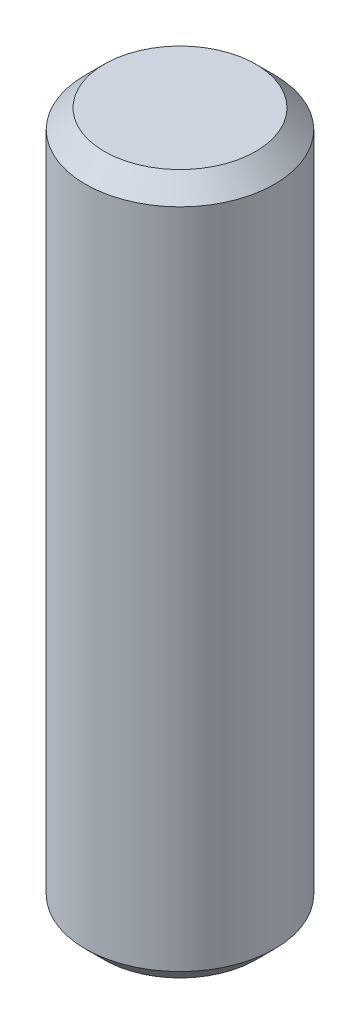
ISO-10303-21;
HEADER;
FILE_DESCRIPTION(('STEP AP214'),'2;1');
FILE_NAME('part.step','',(''),(''),'','','');
FILE_SCHEMA(('AUTOMOTIVE_DESIGN { 1 0 10303 214 1 1 1 1 }'));
ENDSEC;
DATA;
#1=APPLICATION_CONTEXT('core data for automotive mechanical design processes');
#2=APPLICATION_PROTOCOL_DEFINITION('international standard','automotive_design',2000,#1);
#3=PRODUCT_CONTEXT('',#1,'mechanical');
#4=PRODUCT('Part','Part','',(#3));
#5=PRODUCT_RELATED_PRODUCT_CATEGORY('part','',(#4));
#6=PRODUCT_DEFINITION_FORMATION('','',#4);
#7=PRODUCT_DEFINITION_CONTEXT('part definition',#1,'design');
#8=PRODUCT_DEFINITION('design','',#6,#7);
#9=PRODUCT_DEFINITION_SHAPE('','',#8);
#10=(LENGTH_UNIT() NAMED_UNIT(*) SI_UNIT(.MILLI.,.METRE.));
#11=(NAMED_UNIT(*) PLANE_ANGLE_UNIT() SI_UNIT($,.RADIAN.));
#12=(NAMED_UNIT(*) SI_UNIT($,.STERADIAN.) SOLID_ANGLE_UNIT());
#13=UNCERTAINTY_MEASURE_WITH_UNIT(LENGTH_MEASURE(1.E-05),#10,'distance_accuracy_value','');
#14=(GEOMETRIC_REPRESENTATION_CONTEXT(3) GLOBAL_UNCERTAINTY_ASSIGNED_CONTEXT((#13)) GLOBAL_UNIT_ASSIGNED_CONTEXT((#10,
#11,#12)) REPRESENTATION_CONTEXT('',''));
#15=CARTESIAN_POINT('',(0.,0.,0.));
#16=DIRECTION('',(0.,0.,1.));
#17=DIRECTION('',(1.,0.,0.));
#18=AXIS2_PLACEMENT_3D('',#15,#16,#17);
#19=CARTESIAN_POINT('',(0.,74.,0.));
#20=DIRECTION('',(0.,1.,0.));
#21=DIRECTION('',(0.,0.,1.));
#22=AXIS2_PLACEMENT_3D('',#19,#20,#21);
#23=PLANE('',#22);
#24=CARTESIAN_POINT('',(0.,74.,0.));
#25=DIRECTION('',(0.,1.,0.));
#26=DIRECTION('',(0.,0.,1.));
#27=AXIS2_PLACEMENT_3D('',#24,#25,#26);
#28=CIRCLE('',#27,7.99999999999999);
#29=CARTESIAN_POINT('',(0.,74.,7.99999999999999));
#30=VERTEX_POINT('',#29);
#31=EDGE_CURVE('E10',#30,#30,#28,.T.);
#32=ORIENTED_EDGE('',*,*,#31,.T.);
#33=EDGE_LOOP('',(#32));
#34=FACE_BOUND('',#33,.T.);
#35=ADVANCED_FACE('F49',(#34),#23,.T.);
#36=CARTESIAN_POINT('',(0.,0.,0.));
#37=DIRECTION('',(0.,-1.,0.));
#38=DIRECTION('',(0.,0.,-1.));
#39=AXIS2_PLACEMENT_3D('',#36,#37,#38);
#40=CYLINDRICAL_SURFACE('',#39,10.);
#41=CARTESIAN_POINT('',(0.,2.00000000000001,0.));
#42=DIRECTION('',(0.,-1.,0.));
#43=DIRECTION('',(0.,0.,-1.));
#44=AXIS2_PLACEMENT_3D('',#41,#42,#43);
#45=CIRCLE('',#44,10.);
#46=CARTESIAN_POINT('',(0.,2.00000000000001,-10.));
#47=VERTEX_POINT('',#46);
#48=EDGE_CURVE('E58',#47,#47,#45,.F.);
#49=ORIENTED_EDGE('',*,*,#48,.T.);
#50=EDGE_LOOP('',(#49));
#51=FACE_BOUND('',#50,.T.);
#52=CARTESIAN_POINT('',(0.,72.,0.));
#53=DIRECTION('',(0.,1.,0.));
#54=DIRECTION('',(0.,0.,1.));
#55=AXIS2_PLACEMENT_3D('',#52,#53,#54);
#56=CIRCLE('',#55,10.);
#57=CARTESIAN_POINT('',(0.,72.,10.));
#58=VERTEX_POINT('',#57);
#59=EDGE_CURVE('E63',#58,#58,#56,.F.);
#60=ORIENTED_EDGE('',*,*,#59,.T.);
#61=EDGE_LOOP('',(#60));
#62=FACE_BOUND('',#61,.T.);
#63=ADVANCED_FACE('F85',(#51,#62),#40,.T.);
#64=CARTESIAN_POINT('',(0.,0.,0.));
#65=DIRECTION('',(0.,-1.,0.));
#66=DIRECTION('',(0.,0.,-1.));
#67=AXIS2_PLACEMENT_3D('',#64,#65,#66);
#68=PLANE('',#67);
#69=CARTESIAN_POINT('',(0.,0.,0.));
#70=DIRECTION('',(0.,-1.,0.));
#71=DIRECTION('',(0.,0.,-1.));
#72=AXIS2_PLACEMENT_3D('',#69,#70,#71);
#73=CIRCLE('',#72,7.99999999999999);
#74=CARTESIAN_POINT('',(0.,0.,-7.99999999999999));
#75=VERTEX_POINT('',#74);
#76=EDGE_CURVE('E68',#75,#75,#73,.T.);
#77=ORIENTED_EDGE('',*,*,#76,.T.);
#78=EDGE_LOOP('',(#77));
#79=FACE_BOUND('',#78,.T.);
#80=ADVANCED_FACE('F75',(#79),#68,.T.);
#81=CARTESIAN_POINT('',(0.,0.,0.));
#82=DIRECTION('',(0.,1.,0.));
#83=DIRECTION('',(0.,0.,1.));
#84=AXIS2_PLACEMENT_3D('',#81,#82,#83);
#85=CONICAL_SURFACE('',#84,7.99999999999999,0.785398163397448);
#86=ORIENTED_EDGE('',*,*,#48,.F.);
#87=EDGE_LOOP('',(#86));
#88=FACE_BOUND('',#87,.T.);
#89=ORIENTED_EDGE('',*,*,#76,.F.);
#90=EDGE_LOOP('',(#89));
#91=FACE_BOUND('',#90,.T.);
#92=ADVANCED_FACE('F77',(#88,#91),#85,.T.);
#93=CARTESIAN_POINT('',(0.,72.,0.));
#94=DIRECTION('',(0.,-1.,0.));
#95=DIRECTION('',(0.,0.,-1.));
#96=AXIS2_PLACEMENT_3D('',#93,#94,#95);
#97=CONICAL_SURFACE('',#96,10.,0.785398163397453);
#98=ORIENTED_EDGE('',*,*,#31,.F.);
#99=EDGE_LOOP('',(#98));
#100=FACE_BOUND('',#99,.T.);
#101=ORIENTED_EDGE('',*,*,#59,.F.);
#102=EDGE_LOOP('',(#101));
#103=FACE_BOUND('',#102,.T.);
#104=ADVANCED_FACE('F52',(#100,#103),#97,.T.);
#105=CLOSED_SHELL('',(#35,#63,#80,#92,#104));
#106=MANIFOLD_SOLID_BREP('B2',#105);
#107=ADVANCED_BREP_SHAPE_REPRESENTATION('',(#18,#106),#14);
#108=SHAPE_DEFINITION_REPRESENTATION(#9,#107);
ENDSEC;
END-ISO-10303-21;
